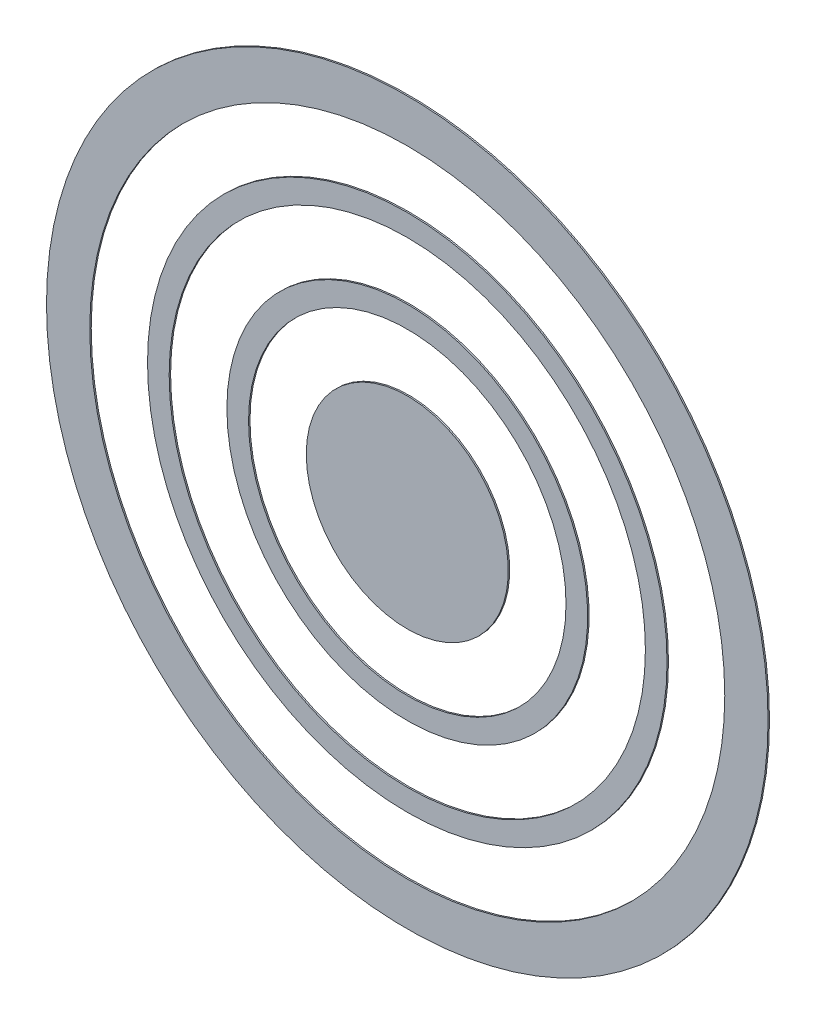
ISO-10303-21;
HEADER;
FILE_DESCRIPTION(('STEP AP214'),'2;1');
FILE_NAME('part.step','',(''),(''),'','','');
FILE_SCHEMA(('AUTOMOTIVE_DESIGN { 1 0 10303 214 1 1 1 1 }'));
ENDSEC;
DATA;
#1=APPLICATION_CONTEXT('core data for automotive mechanical design processes');
#2=APPLICATION_PROTOCOL_DEFINITION('international standard','automotive_design',2000,#1);
#3=PRODUCT_CONTEXT('',#1,'mechanical');
#4=PRODUCT('Part','Part','',(#3));
#5=PRODUCT_RELATED_PRODUCT_CATEGORY('part','',(#4));
#6=PRODUCT_DEFINITION_FORMATION('','',#4);
#7=PRODUCT_DEFINITION_CONTEXT('part definition',#1,'design');
#8=PRODUCT_DEFINITION('design','',#6,#7);
#9=PRODUCT_DEFINITION_SHAPE('','',#8);
#10=(LENGTH_UNIT() NAMED_UNIT(*) SI_UNIT(.MILLI.,.METRE.));
#11=(NAMED_UNIT(*) PLANE_ANGLE_UNIT() SI_UNIT($,.RADIAN.));
#12=(NAMED_UNIT(*) SI_UNIT($,.STERADIAN.) SOLID_ANGLE_UNIT());
#13=UNCERTAINTY_MEASURE_WITH_UNIT(LENGTH_MEASURE(1.E-05),#10,'distance_accuracy_value','');
#14=(GEOMETRIC_REPRESENTATION_CONTEXT(3) GLOBAL_UNCERTAINTY_ASSIGNED_CONTEXT((#13)) GLOBAL_UNIT_ASSIGNED_CONTEXT((#10,
#11,#12)) REPRESENTATION_CONTEXT('',''));
#15=CARTESIAN_POINT('',(0.,0.,0.));
#16=DIRECTION('',(0.,0.,1.));
#17=DIRECTION('',(1.,0.,0.));
#18=AXIS2_PLACEMENT_3D('',#15,#16,#17);
#19=CARTESIAN_POINT('',(0.,0.,0.01));
#20=DIRECTION('',(0.,0.,-1.));
#21=DIRECTION('',(-1.,0.,0.));
#22=AXIS2_PLACEMENT_3D('',#19,#20,#21);
#23=CYLINDRICAL_SURFACE('',#22,0.7);
#24=CARTESIAN_POINT('',(0.,0.,0.01));
#25=DIRECTION('',(0.,0.,1.));
#26=DIRECTION('',(1.,0.,0.));
#27=AXIS2_PLACEMENT_3D('',#24,#25,#26);
#28=CIRCLE('',#27,0.7);
#29=CARTESIAN_POINT('',(-0.7,0.,0.01));
#30=VERTEX_POINT('',#29);
#31=EDGE_CURVE('E12',#30,#30,#28,.T.);
#32=CARTESIAN_POINT('',(0.,0.,0.));
#33=DIRECTION('',(0.,0.,1.));
#34=DIRECTION('',(1.,0.,0.));
#35=AXIS2_PLACEMENT_3D('',#32,#33,#34);
#36=CIRCLE('',#35,0.7);
#37=CARTESIAN_POINT('',(-0.7,0.,0.));
#38=VERTEX_POINT('',#37);
#39=EDGE_CURVE('E83',#38,#38,#36,.T.);
#40=CARTESIAN_POINT('',(-0.7,0.,0.01));
#41=CARTESIAN_POINT('',(-0.7,0.,0.00989583333333333));
#42=CARTESIAN_POINT('',(-0.7,0.,0.00979166666666667));
#43=CARTESIAN_POINT('',(-0.7,0.,0.00958333333333333));
#44=CARTESIAN_POINT('',(-0.7,0.,0.00947916666666667));
#45=CARTESIAN_POINT('',(-0.7,0.,0.00927083333333333));
#46=CARTESIAN_POINT('',(-0.7,0.,0.00916666666666667));
#47=CARTESIAN_POINT('',(-0.7,0.,0.00895833333333333));
#48=CARTESIAN_POINT('',(-0.7,0.,0.00885416666666667));
#49=CARTESIAN_POINT('',(-0.7,0.,0.00864583333333333));
#50=CARTESIAN_POINT('',(-0.7,0.,0.00854166666666667));
#51=CARTESIAN_POINT('',(-0.7,0.,0.00833333333333333));
#52=CARTESIAN_POINT('',(-0.7,0.,0.00822916666666667));
#53=CARTESIAN_POINT('',(-0.7,0.,0.00802083333333333));
#54=CARTESIAN_POINT('',(-0.7,0.,0.00791666666666667));
#55=CARTESIAN_POINT('',(-0.7,0.,0.00770833333333333));
#56=CARTESIAN_POINT('',(-0.7,0.,0.00760416666666667));
#57=CARTESIAN_POINT('',(-0.7,0.,0.00739583333333333));
#58=CARTESIAN_POINT('',(-0.7,0.,0.00729166666666667));
#59=CARTESIAN_POINT('',(-0.7,0.,0.00708333333333333));
#60=CARTESIAN_POINT('',(-0.7,0.,0.00697916666666667));
#61=CARTESIAN_POINT('',(-0.7,0.,0.00677083333333333));
#62=CARTESIAN_POINT('',(-0.7,0.,0.00666666666666667));
#63=CARTESIAN_POINT('',(-0.7,0.,0.00645833333333333));
#64=CARTESIAN_POINT('',(-0.7,0.,0.00635416666666667));
#65=CARTESIAN_POINT('',(-0.7,0.,0.00614583333333333));
#66=CARTESIAN_POINT('',(-0.7,0.,0.00604166666666667));
#67=CARTESIAN_POINT('',(-0.7,0.,0.00583333333333333));
#68=CARTESIAN_POINT('',(-0.7,0.,0.00572916666666667));
#69=CARTESIAN_POINT('',(-0.7,0.,0.00552083333333333));
#70=CARTESIAN_POINT('',(-0.7,0.,0.00541666666666667));
#71=CARTESIAN_POINT('',(-0.7,0.,0.00520833333333333));
#72=CARTESIAN_POINT('',(-0.7,0.,0.00510416666666667));
#73=CARTESIAN_POINT('',(-0.7,0.,0.00489583333333333));
#74=CARTESIAN_POINT('',(-0.7,0.,0.00479166666666667));
#75=CARTESIAN_POINT('',(-0.7,0.,0.00458333333333333));
#76=CARTESIAN_POINT('',(-0.7,0.,0.00447916666666667));
#77=CARTESIAN_POINT('',(-0.7,0.,0.00427083333333333));
#78=CARTESIAN_POINT('',(-0.7,0.,0.00416666666666667));
#79=CARTESIAN_POINT('',(-0.7,0.,0.00395833333333333));
#80=CARTESIAN_POINT('',(-0.7,0.,0.00385416666666667));
#81=CARTESIAN_POINT('',(-0.7,0.,0.00364583333333333));
#82=CARTESIAN_POINT('',(-0.7,0.,0.00354166666666667));
#83=CARTESIAN_POINT('',(-0.7,0.,0.00333333333333333));
#84=CARTESIAN_POINT('',(-0.7,0.,0.00322916666666667));
#85=CARTESIAN_POINT('',(-0.7,0.,0.00302083333333333));
#86=CARTESIAN_POINT('',(-0.7,0.,0.00291666666666667));
#87=CARTESIAN_POINT('',(-0.7,0.,0.00270833333333333));
#88=CARTESIAN_POINT('',(-0.7,0.,0.00260416666666667));
#89=CARTESIAN_POINT('',(-0.7,0.,0.00239583333333333));
#90=CARTESIAN_POINT('',(-0.7,0.,0.00229166666666667));
#91=CARTESIAN_POINT('',(-0.7,0.,0.00208333333333333));
#92=CARTESIAN_POINT('',(-0.7,0.,0.00197916666666667));
#93=CARTESIAN_POINT('',(-0.7,0.,0.00177083333333333));
#94=CARTESIAN_POINT('',(-0.7,0.,0.00166666666666667));
#95=CARTESIAN_POINT('',(-0.7,0.,0.00145833333333333));
#96=CARTESIAN_POINT('',(-0.7,0.,0.00135416666666667));
#97=CARTESIAN_POINT('',(-0.7,0.,0.00114583333333333));
#98=CARTESIAN_POINT('',(-0.7,0.,0.00104166666666667));
#99=CARTESIAN_POINT('',(-0.7,0.,0.000833333333333334));
#100=CARTESIAN_POINT('',(-0.7,0.,0.000729166666666667));
#101=CARTESIAN_POINT('',(-0.7,0.,0.000520833333333334));
#102=CARTESIAN_POINT('',(-0.7,0.,0.000416666666666667));
#103=CARTESIAN_POINT('',(-0.7,0.,0.000208333333333334));
#104=CARTESIAN_POINT('',(-0.7,0.,0.000104166666666667));
#105=CARTESIAN_POINT('',(-0.7,0.,0.));
#106=B_SPLINE_CURVE_WITH_KNOTS('',3,(#40,#41,#42,#43,#44,#45,#46,#47,#48,#49,#50,#51,#52,#53,
#54,#55,#56,#57,#58,#59,#60,#61,#62,#63,#64,#65,#66,#67,#68,#69,#70,#71,#72,#73,#74,#75,#76,#77,
#78,#79,#80,#81,#82,#83,#84,#85,#86,#87,#88,#89,#90,#91,#92,#93,#94,#95,#96,#97,#98,#99,#100,
#101,#102,#103,#104,#105),.UNSPECIFIED.,.F.,.F.,(4,2,2,2,2,2,2,2,2,2,2,2,2,2,2,2,2,2,2,2,2,2,2,
2,2,2,2,2,2,2,2,2,4),(0.,0.000312500000000001,0.000625000000000002,0.000937500000000001,0.00125,
0.0015625,0.001875,0.0021875,0.0025,0.0028125,0.003125,0.0034375,0.00375,0.0040625,0.004375,
0.0046875,0.005,0.0053125,0.005625,0.0059375,0.00625,0.0065625,0.006875,0.0071875,0.0075,
0.0078125,0.008125,0.0084375,0.00875,0.0090625,0.009375,0.0096875,0.01),.UNSPECIFIED.);
#107=EDGE_CURVE('BSEAM80',#30,#38,#106,.T.);
#108=ORIENTED_EDGE('',*,*,#31,.F.);
#109=ORIENTED_EDGE('',*,*,#39,.T.);
#110=ORIENTED_EDGE('',*,*,#107,.T.);
#111=ORIENTED_EDGE('',*,*,#107,.F.);
#112=EDGE_LOOP('',(#108,#110,#109,#111));
#113=FACE_BOUND('',#112,.T.);
#114=ADVANCED_FACE('F80',(#113),#23,.T.);
#115=CARTESIAN_POINT('',(0.,0.,0.01));
#116=DIRECTION('',(0.,0.,1.));
#117=DIRECTION('',(1.,0.,0.));
#118=AXIS2_PLACEMENT_3D('',#115,#116,#117);
#119=PLANE('',#118);
#120=ORIENTED_EDGE('',*,*,#31,.T.);
#121=EDGE_LOOP('',(#120));
#122=FACE_BOUND('',#121,.T.);
#123=ADVANCED_FACE('F95',(#122),#119,.T.);
#124=CARTESIAN_POINT('',(0.,0.,0.));
#125=DIRECTION('',(0.,0.,1.));
#126=DIRECTION('',(1.,0.,0.));
#127=AXIS2_PLACEMENT_3D('',#124,#125,#126);
#128=PLANE('',#127);
#129=ORIENTED_EDGE('',*,*,#39,.F.);
#130=EDGE_LOOP('',(#129));
#131=FACE_BOUND('',#130,.T.);
#132=ADVANCED_FACE('F93',(#131),#128,.F.);
#133=CLOSED_SHELL('',(#114,#123,#132));
#134=MANIFOLD_SOLID_BREP('B2',#133);
#135=CARTESIAN_POINT('',(0.,0.,0.01));
#136=DIRECTION('',(0.,0.,-1.));
#137=DIRECTION('',(-1.,0.,0.));
#138=AXIS2_PLACEMENT_3D('',#135,#136,#137);
#139=CYLINDRICAL_SURFACE('',#138,1.1);
#140=CARTESIAN_POINT('',(0.,0.,0.01));
#141=DIRECTION('',(0.,0.,1.));
#142=DIRECTION('',(1.,0.,0.));
#143=AXIS2_PLACEMENT_3D('',#140,#141,#142);
#144=CIRCLE('',#143,1.1);
#145=CARTESIAN_POINT('',(-1.1,0.,0.01));
#146=VERTEX_POINT('',#145);
#147=EDGE_CURVE('E136',#146,#146,#144,.T.);
#148=CARTESIAN_POINT('',(0.,0.,0.));
#149=DIRECTION('',(0.,0.,1.));
#150=DIRECTION('',(1.,0.,0.));
#151=AXIS2_PLACEMENT_3D('',#148,#149,#150);
#152=CIRCLE('',#151,1.1);
#153=CARTESIAN_POINT('',(-1.1,0.,0.));
#154=VERTEX_POINT('',#153);
#155=EDGE_CURVE('E142',#154,#154,#152,.T.);
#156=CARTESIAN_POINT('',(-1.1,0.,0.01));
#157=CARTESIAN_POINT('',(-1.1,0.,0.00989583333333333));
#158=CARTESIAN_POINT('',(-1.1,0.,0.00979166666666667));
#159=CARTESIAN_POINT('',(-1.1,0.,0.00958333333333333));
#160=CARTESIAN_POINT('',(-1.1,0.,0.00947916666666667));
#161=CARTESIAN_POINT('',(-1.1,0.,0.00927083333333333));
#162=CARTESIAN_POINT('',(-1.1,0.,0.00916666666666667));
#163=CARTESIAN_POINT('',(-1.1,0.,0.00895833333333333));
#164=CARTESIAN_POINT('',(-1.1,0.,0.00885416666666667));
#165=CARTESIAN_POINT('',(-1.1,0.,0.00864583333333333));
#166=CARTESIAN_POINT('',(-1.1,0.,0.00854166666666667));
#167=CARTESIAN_POINT('',(-1.1,0.,0.00833333333333333));
#168=CARTESIAN_POINT('',(-1.1,0.,0.00822916666666667));
#169=CARTESIAN_POINT('',(-1.1,0.,0.00802083333333333));
#170=CARTESIAN_POINT('',(-1.1,0.,0.00791666666666667));
#171=CARTESIAN_POINT('',(-1.1,0.,0.00770833333333333));
#172=CARTESIAN_POINT('',(-1.1,0.,0.00760416666666667));
#173=CARTESIAN_POINT('',(-1.1,0.,0.00739583333333333));
#174=CARTESIAN_POINT('',(-1.1,0.,0.00729166666666667));
#175=CARTESIAN_POINT('',(-1.1,0.,0.00708333333333333));
#176=CARTESIAN_POINT('',(-1.1,0.,0.00697916666666667));
#177=CARTESIAN_POINT('',(-1.1,0.,0.00677083333333333));
#178=CARTESIAN_POINT('',(-1.1,0.,0.00666666666666667));
#179=CARTESIAN_POINT('',(-1.1,0.,0.00645833333333333));
#180=CARTESIAN_POINT('',(-1.1,0.,0.00635416666666667));
#181=CARTESIAN_POINT('',(-1.1,0.,0.00614583333333333));
#182=CARTESIAN_POINT('',(-1.1,0.,0.00604166666666667));
#183=CARTESIAN_POINT('',(-1.1,0.,0.00583333333333333));
#184=CARTESIAN_POINT('',(-1.1,0.,0.00572916666666667));
#185=CARTESIAN_POINT('',(-1.1,0.,0.00552083333333333));
#186=CARTESIAN_POINT('',(-1.1,0.,0.00541666666666667));
#187=CARTESIAN_POINT('',(-1.1,0.,0.00520833333333333));
#188=CARTESIAN_POINT('',(-1.1,0.,0.00510416666666667));
#189=CARTESIAN_POINT('',(-1.1,0.,0.00489583333333333));
#190=CARTESIAN_POINT('',(-1.1,0.,0.00479166666666667));
#191=CARTESIAN_POINT('',(-1.1,0.,0.00458333333333333));
#192=CARTESIAN_POINT('',(-1.1,0.,0.00447916666666667));
#193=CARTESIAN_POINT('',(-1.1,0.,0.00427083333333333));
#194=CARTESIAN_POINT('',(-1.1,0.,0.00416666666666667));
#195=CARTESIAN_POINT('',(-1.1,0.,0.00395833333333333));
#196=CARTESIAN_POINT('',(-1.1,0.,0.00385416666666667));
#197=CARTESIAN_POINT('',(-1.1,0.,0.00364583333333333));
#198=CARTESIAN_POINT('',(-1.1,0.,0.00354166666666667));
#199=CARTESIAN_POINT('',(-1.1,0.,0.00333333333333333));
#200=CARTESIAN_POINT('',(-1.1,0.,0.00322916666666667));
#201=CARTESIAN_POINT('',(-1.1,0.,0.00302083333333333));
#202=CARTESIAN_POINT('',(-1.1,0.,0.00291666666666667));
#203=CARTESIAN_POINT('',(-1.1,0.,0.00270833333333333));
#204=CARTESIAN_POINT('',(-1.1,0.,0.00260416666666667));
#205=CARTESIAN_POINT('',(-1.1,0.,0.00239583333333333));
#206=CARTESIAN_POINT('',(-1.1,0.,0.00229166666666667));
#207=CARTESIAN_POINT('',(-1.1,0.,0.00208333333333333));
#208=CARTESIAN_POINT('',(-1.1,0.,0.00197916666666667));
#209=CARTESIAN_POINT('',(-1.1,0.,0.00177083333333333));
#210=CARTESIAN_POINT('',(-1.1,0.,0.00166666666666667));
#211=CARTESIAN_POINT('',(-1.1,0.,0.00145833333333333));
#212=CARTESIAN_POINT('',(-1.1,0.,0.00135416666666667));
#213=CARTESIAN_POINT('',(-1.1,0.,0.00114583333333333));
#214=CARTESIAN_POINT('',(-1.1,0.,0.00104166666666667));
#215=CARTESIAN_POINT('',(-1.1,0.,0.000833333333333334));
#216=CARTESIAN_POINT('',(-1.1,0.,0.000729166666666667));
#217=CARTESIAN_POINT('',(-1.1,0.,0.000520833333333334));
#218=CARTESIAN_POINT('',(-1.1,0.,0.000416666666666667));
#219=CARTESIAN_POINT('',(-1.1,0.,0.000208333333333334));
#220=CARTESIAN_POINT('',(-1.1,0.,0.000104166666666667));
#221=CARTESIAN_POINT('',(-1.1,0.,0.));
#222=B_SPLINE_CURVE_WITH_KNOTS('',3,(#156,#157,#158,#159,#160,#161,#162,#163,#164,#165,#166,
#167,#168,#169,#170,#171,#172,#173,#174,#175,#176,#177,#178,#179,#180,#181,#182,#183,#184,#185,
#186,#187,#188,#189,#190,#191,#192,#193,#194,#195,#196,#197,#198,#199,#200,#201,#202,#203,#204,
#205,#206,#207,#208,#209,#210,#211,#212,#213,#214,#215,#216,#217,#218,#219,#220,#221),
.UNSPECIFIED.,.F.,.F.,(4,2,2,2,2,2,2,2,2,2,2,2,2,2,2,2,2,2,2,2,2,2,2,2,2,2,2,2,2,2,2,2,4),(0.,
0.000312499999999999,0.000624999999999998,0.000937499999999999,0.00125,0.0015625,0.001875,
0.0021875,0.0025,0.0028125,0.003125,0.0034375,0.00375,0.0040625,0.004375,0.0046875,0.005,
0.0053125,0.005625,0.0059375,0.00625,0.0065625,0.006875,0.0071875,0.0075,0.0078125,0.008125,
0.0084375,0.00875,0.0090625,0.009375,0.0096875,0.01),.UNSPECIFIED.);
#223=EDGE_CURVE('BSEAM129',#146,#154,#222,.T.);
#224=ORIENTED_EDGE('',*,*,#147,.T.);
#225=ORIENTED_EDGE('',*,*,#155,.F.);
#226=ORIENTED_EDGE('',*,*,#223,.T.);
#227=ORIENTED_EDGE('',*,*,#223,.F.);
#228=EDGE_LOOP('',(#224,#226,#225,#227));
#229=FACE_BOUND('',#228,.T.);
#230=ADVANCED_FACE('F129',(#229),#139,.F.);
#231=CARTESIAN_POINT('',(0.,0.,0.01));
#232=DIRECTION('',(0.,0.,-1.));
#233=DIRECTION('',(-1.,0.,0.));
#234=AXIS2_PLACEMENT_3D('',#231,#232,#233);
#235=CYLINDRICAL_SURFACE('',#234,1.25);
#236=CARTESIAN_POINT('',(0.,0.,0.01));
#237=DIRECTION('',(0.,0.,1.));
#238=DIRECTION('',(1.,0.,0.));
#239=AXIS2_PLACEMENT_3D('',#236,#237,#238);
#240=CIRCLE('',#239,1.25);
#241=CARTESIAN_POINT('',(-1.25,0.,0.01));
#242=VERTEX_POINT('',#241);
#243=EDGE_CURVE('E79',#242,#242,#240,.T.);
#244=CARTESIAN_POINT('',(0.,0.,0.));
#245=DIRECTION('',(0.,0.,1.));
#246=DIRECTION('',(1.,0.,0.));
#247=AXIS2_PLACEMENT_3D('',#244,#245,#246);
#248=CIRCLE('',#247,1.25);
#249=CARTESIAN_POINT('',(-1.25,0.,0.));
#250=VERTEX_POINT('',#249);
#251=EDGE_CURVE('E132',#250,#250,#248,.T.);
#252=CARTESIAN_POINT('',(-1.25,0.,0.01));
#253=CARTESIAN_POINT('',(-1.25,0.,0.00989583333333333));
#254=CARTESIAN_POINT('',(-1.25,0.,0.00979166666666667));
#255=CARTESIAN_POINT('',(-1.25,0.,0.00958333333333333));
#256=CARTESIAN_POINT('',(-1.25,0.,0.00947916666666667));
#257=CARTESIAN_POINT('',(-1.25,0.,0.00927083333333333));
#258=CARTESIAN_POINT('',(-1.25,0.,0.00916666666666667));
#259=CARTESIAN_POINT('',(-1.25,0.,0.00895833333333333));
#260=CARTESIAN_POINT('',(-1.25,0.,0.00885416666666667));
#261=CARTESIAN_POINT('',(-1.25,0.,0.00864583333333333));
#262=CARTESIAN_POINT('',(-1.25,0.,0.00854166666666667));
#263=CARTESIAN_POINT('',(-1.25,0.,0.00833333333333333));
#264=CARTESIAN_POINT('',(-1.25,0.,0.00822916666666667));
#265=CARTESIAN_POINT('',(-1.25,0.,0.00802083333333333));
#266=CARTESIAN_POINT('',(-1.25,0.,0.00791666666666667));
#267=CARTESIAN_POINT('',(-1.25,0.,0.00770833333333333));
#268=CARTESIAN_POINT('',(-1.25,0.,0.00760416666666667));
#269=CARTESIAN_POINT('',(-1.25,0.,0.00739583333333333));
#270=CARTESIAN_POINT('',(-1.25,0.,0.00729166666666667));
#271=CARTESIAN_POINT('',(-1.25,0.,0.00708333333333333));
#272=CARTESIAN_POINT('',(-1.25,0.,0.00697916666666667));
#273=CARTESIAN_POINT('',(-1.25,0.,0.00677083333333333));
#274=CARTESIAN_POINT('',(-1.25,0.,0.00666666666666667));
#275=CARTESIAN_POINT('',(-1.25,0.,0.00645833333333333));
#276=CARTESIAN_POINT('',(-1.25,0.,0.00635416666666667));
#277=CARTESIAN_POINT('',(-1.25,0.,0.00614583333333333));
#278=CARTESIAN_POINT('',(-1.25,0.,0.00604166666666667));
#279=CARTESIAN_POINT('',(-1.25,0.,0.00583333333333333));
#280=CARTESIAN_POINT('',(-1.25,0.,0.00572916666666667));
#281=CARTESIAN_POINT('',(-1.25,0.,0.00552083333333333));
#282=CARTESIAN_POINT('',(-1.25,0.,0.00541666666666667));
#283=CARTESIAN_POINT('',(-1.25,0.,0.00520833333333333));
#284=CARTESIAN_POINT('',(-1.25,0.,0.00510416666666667));
#285=CARTESIAN_POINT('',(-1.25,0.,0.00489583333333333));
#286=CARTESIAN_POINT('',(-1.25,0.,0.00479166666666667));
#287=CARTESIAN_POINT('',(-1.25,0.,0.00458333333333333));
#288=CARTESIAN_POINT('',(-1.25,0.,0.00447916666666667));
#289=CARTESIAN_POINT('',(-1.25,0.,0.00427083333333333));
#290=CARTESIAN_POINT('',(-1.25,0.,0.00416666666666667));
#291=CARTESIAN_POINT('',(-1.25,0.,0.00395833333333333));
#292=CARTESIAN_POINT('',(-1.25,0.,0.00385416666666667));
#293=CARTESIAN_POINT('',(-1.25,0.,0.00364583333333333));
#294=CARTESIAN_POINT('',(-1.25,0.,0.00354166666666667));
#295=CARTESIAN_POINT('',(-1.25,0.,0.00333333333333333));
#296=CARTESIAN_POINT('',(-1.25,0.,0.00322916666666667));
#297=CARTESIAN_POINT('',(-1.25,0.,0.00302083333333333));
#298=CARTESIAN_POINT('',(-1.25,0.,0.00291666666666667));
#299=CARTESIAN_POINT('',(-1.25,0.,0.00270833333333333));
#300=CARTESIAN_POINT('',(-1.25,0.,0.00260416666666667));
#301=CARTESIAN_POINT('',(-1.25,0.,0.00239583333333333));
#302=CARTESIAN_POINT('',(-1.25,0.,0.00229166666666667));
#303=CARTESIAN_POINT('',(-1.25,0.,0.00208333333333333));
#304=CARTESIAN_POINT('',(-1.25,0.,0.00197916666666667));
#305=CARTESIAN_POINT('',(-1.25,0.,0.00177083333333333));
#306=CARTESIAN_POINT('',(-1.25,0.,0.00166666666666667));
#307=CARTESIAN_POINT('',(-1.25,0.,0.00145833333333333));
#308=CARTESIAN_POINT('',(-1.25,0.,0.00135416666666667));
#309=CARTESIAN_POINT('',(-1.25,0.,0.00114583333333333));
#310=CARTESIAN_POINT('',(-1.25,0.,0.00104166666666667));
#311=CARTESIAN_POINT('',(-1.25,0.,0.000833333333333334));
#312=CARTESIAN_POINT('',(-1.25,0.,0.000729166666666667));
#313=CARTESIAN_POINT('',(-1.25,0.,0.000520833333333334));
#314=CARTESIAN_POINT('',(-1.25,0.,0.000416666666666667));
#315=CARTESIAN_POINT('',(-1.25,0.,0.000208333333333334));
#316=CARTESIAN_POINT('',(-1.25,0.,0.000104166666666667));
#317=CARTESIAN_POINT('',(-1.25,0.,0.));
#318=B_SPLINE_CURVE_WITH_KNOTS('',3,(#252,#253,#254,#255,#256,#257,#258,#259,#260,#261,#262,
#263,#264,#265,#266,#267,#268,#269,#270,#271,#272,#273,#274,#275,#276,#277,#278,#279,#280,#281,
#282,#283,#284,#285,#286,#287,#288,#289,#290,#291,#292,#293,#294,#295,#296,#297,#298,#299,#300,
#301,#302,#303,#304,#305,#306,#307,#308,#309,#310,#311,#312,#313,#314,#315,#316,#317),
.UNSPECIFIED.,.F.,.F.,(4,2,2,2,2,2,2,2,2,2,2,2,2,2,2,2,2,2,2,2,2,2,2,2,2,2,2,2,2,2,2,2,4),(0.,
0.000312500000000001,0.000625000000000002,0.000937500000000001,0.00125,0.0015625,0.001875,
0.0021875,0.0025,0.0028125,0.003125,0.0034375,0.00375,0.0040625,0.004375,0.0046875,0.005,
0.0053125,0.005625,0.0059375,0.00625,0.0065625,0.006875,0.0071875,0.0075,0.0078125,0.008125,
0.0084375,0.00875,0.0090625,0.009375,0.0096875,0.01),.UNSPECIFIED.);
#319=EDGE_CURVE('BSEAM149',#242,#250,#318,.T.);
#320=ORIENTED_EDGE('',*,*,#243,.F.);
#321=ORIENTED_EDGE('',*,*,#251,.T.);
#322=ORIENTED_EDGE('',*,*,#319,.T.);
#323=ORIENTED_EDGE('',*,*,#319,.F.);
#324=EDGE_LOOP('',(#320,#322,#321,#323));
#325=FACE_BOUND('',#324,.T.);
#326=ADVANCED_FACE('F149',(#325),#235,.T.);
#327=CARTESIAN_POINT('',(0.,0.,0.01));
#328=DIRECTION('',(0.,0.,1.));
#329=DIRECTION('',(1.,0.,0.));
#330=AXIS2_PLACEMENT_3D('',#327,#328,#329);
#331=PLANE('',#330);
#332=ORIENTED_EDGE('',*,*,#147,.F.);
#333=EDGE_LOOP('',(#332));
#334=FACE_BOUND('',#333,.T.);
#335=ORIENTED_EDGE('',*,*,#243,.T.);
#336=EDGE_LOOP('',(#335));
#337=FACE_BOUND('',#336,.T.);
#338=ADVANCED_FACE('F153',(#334,#337),#331,.T.);
#339=CARTESIAN_POINT('',(0.,0.,0.));
#340=DIRECTION('',(0.,0.,1.));
#341=DIRECTION('',(1.,0.,0.));
#342=AXIS2_PLACEMENT_3D('',#339,#340,#341);
#343=PLANE('',#342);
#344=ORIENTED_EDGE('',*,*,#155,.T.);
#345=EDGE_LOOP('',(#344));
#346=FACE_BOUND('',#345,.T.);
#347=ORIENTED_EDGE('',*,*,#251,.F.);
#348=EDGE_LOOP('',(#347));
#349=FACE_BOUND('',#348,.T.);
#350=ADVANCED_FACE('F151',(#346,#349),#343,.F.);
#351=CLOSED_SHELL('',(#230,#326,#338,#350));
#352=MANIFOLD_SOLID_BREP('B7',#351);
#353=CARTESIAN_POINT('',(0.,0.,0.01));
#354=DIRECTION('',(0.,0.,-1.));
#355=DIRECTION('',(-1.,0.,0.));
#356=AXIS2_PLACEMENT_3D('',#353,#354,#355);
#357=CYLINDRICAL_SURFACE('',#356,1.65);
#358=CARTESIAN_POINT('',(0.,0.,0.01));
#359=DIRECTION('',(0.,0.,1.));
#360=DIRECTION('',(1.,0.,0.));
#361=AXIS2_PLACEMENT_3D('',#358,#359,#360);
#362=CIRCLE('',#361,1.65);
#363=CARTESIAN_POINT('',(-1.65,0.,0.01));
#364=VERTEX_POINT('',#363);
#365=EDGE_CURVE('E205',#364,#364,#362,.T.);
#366=CARTESIAN_POINT('',(0.,0.,0.));
#367=DIRECTION('',(0.,0.,1.));
#368=DIRECTION('',(1.,0.,0.));
#369=AXIS2_PLACEMENT_3D('',#366,#367,#368);
#370=CIRCLE('',#369,1.65);
#371=CARTESIAN_POINT('',(-1.65,0.,0.));
#372=VERTEX_POINT('',#371);
#373=EDGE_CURVE('E211',#372,#372,#370,.T.);
#374=CARTESIAN_POINT('',(-1.65,0.,0.01));
#375=CARTESIAN_POINT('',(-1.65,0.,0.00989583333333333));
#376=CARTESIAN_POINT('',(-1.65,0.,0.00979166666666667));
#377=CARTESIAN_POINT('',(-1.65,0.,0.00958333333333333));
#378=CARTESIAN_POINT('',(-1.65,0.,0.00947916666666667));
#379=CARTESIAN_POINT('',(-1.65,0.,0.00927083333333333));
#380=CARTESIAN_POINT('',(-1.65,0.,0.00916666666666667));
#381=CARTESIAN_POINT('',(-1.65,0.,0.00895833333333333));
#382=CARTESIAN_POINT('',(-1.65,0.,0.00885416666666667));
#383=CARTESIAN_POINT('',(-1.65,0.,0.00864583333333333));
#384=CARTESIAN_POINT('',(-1.65,0.,0.00854166666666667));
#385=CARTESIAN_POINT('',(-1.65,0.,0.00833333333333333));
#386=CARTESIAN_POINT('',(-1.65,0.,0.00822916666666667));
#387=CARTESIAN_POINT('',(-1.65,0.,0.00802083333333333));
#388=CARTESIAN_POINT('',(-1.65,0.,0.00791666666666667));
#389=CARTESIAN_POINT('',(-1.65,0.,0.00770833333333333));
#390=CARTESIAN_POINT('',(-1.65,0.,0.00760416666666667));
#391=CARTESIAN_POINT('',(-1.65,0.,0.00739583333333333));
#392=CARTESIAN_POINT('',(-1.65,0.,0.00729166666666667));
#393=CARTESIAN_POINT('',(-1.65,0.,0.00708333333333333));
#394=CARTESIAN_POINT('',(-1.65,0.,0.00697916666666667));
#395=CARTESIAN_POINT('',(-1.65,0.,0.00677083333333333));
#396=CARTESIAN_POINT('',(-1.65,0.,0.00666666666666667));
#397=CARTESIAN_POINT('',(-1.65,0.,0.00645833333333333));
#398=CARTESIAN_POINT('',(-1.65,0.,0.00635416666666667));
#399=CARTESIAN_POINT('',(-1.65,0.,0.00614583333333333));
#400=CARTESIAN_POINT('',(-1.65,0.,0.00604166666666667));
#401=CARTESIAN_POINT('',(-1.65,0.,0.00583333333333333));
#402=CARTESIAN_POINT('',(-1.65,0.,0.00572916666666667));
#403=CARTESIAN_POINT('',(-1.65,0.,0.00552083333333333));
#404=CARTESIAN_POINT('',(-1.65,0.,0.00541666666666667));
#405=CARTESIAN_POINT('',(-1.65,0.,0.00520833333333333));
#406=CARTESIAN_POINT('',(-1.65,0.,0.00510416666666667));
#407=CARTESIAN_POINT('',(-1.65,0.,0.00489583333333333));
#408=CARTESIAN_POINT('',(-1.65,0.,0.00479166666666667));
#409=CARTESIAN_POINT('',(-1.65,0.,0.00458333333333333));
#410=CARTESIAN_POINT('',(-1.65,0.,0.00447916666666667));
#411=CARTESIAN_POINT('',(-1.65,0.,0.00427083333333333));
#412=CARTESIAN_POINT('',(-1.65,0.,0.00416666666666667));
#413=CARTESIAN_POINT('',(-1.65,0.,0.00395833333333333));
#414=CARTESIAN_POINT('',(-1.65,0.,0.00385416666666667));
#415=CARTESIAN_POINT('',(-1.65,0.,0.00364583333333333));
#416=CARTESIAN_POINT('',(-1.65,0.,0.00354166666666667));
#417=CARTESIAN_POINT('',(-1.65,0.,0.00333333333333333));
#418=CARTESIAN_POINT('',(-1.65,0.,0.00322916666666667));
#419=CARTESIAN_POINT('',(-1.65,0.,0.00302083333333333));
#420=CARTESIAN_POINT('',(-1.65,0.,0.00291666666666667));
#421=CARTESIAN_POINT('',(-1.65,0.,0.00270833333333333));
#422=CARTESIAN_POINT('',(-1.65,0.,0.00260416666666667));
#423=CARTESIAN_POINT('',(-1.65,0.,0.00239583333333333));
#424=CARTESIAN_POINT('',(-1.65,0.,0.00229166666666667));
#425=CARTESIAN_POINT('',(-1.65,0.,0.00208333333333333));
#426=CARTESIAN_POINT('',(-1.65,0.,0.00197916666666667));
#427=CARTESIAN_POINT('',(-1.65,0.,0.00177083333333333));
#428=CARTESIAN_POINT('',(-1.65,0.,0.00166666666666667));
#429=CARTESIAN_POINT('',(-1.65,0.,0.00145833333333333));
#430=CARTESIAN_POINT('',(-1.65,0.,0.00135416666666667));
#431=CARTESIAN_POINT('',(-1.65,0.,0.00114583333333333));
#432=CARTESIAN_POINT('',(-1.65,0.,0.00104166666666667));
#433=CARTESIAN_POINT('',(-1.65,0.,0.000833333333333334));
#434=CARTESIAN_POINT('',(-1.65,0.,0.000729166666666667));
#435=CARTESIAN_POINT('',(-1.65,0.,0.000520833333333334));
#436=CARTESIAN_POINT('',(-1.65,0.,0.000416666666666667));
#437=CARTESIAN_POINT('',(-1.65,0.,0.000208333333333334));
#438=CARTESIAN_POINT('',(-1.65,0.,0.000104166666666667));
#439=CARTESIAN_POINT('',(-1.65,0.,0.));
#440=B_SPLINE_CURVE_WITH_KNOTS('',3,(#374,#375,#376,#377,#378,#379,#380,#381,#382,#383,#384,
#385,#386,#387,#388,#389,#390,#391,#392,#393,#394,#395,#396,#397,#398,#399,#400,#401,#402,#403,
#404,#405,#406,#407,#408,#409,#410,#411,#412,#413,#414,#415,#416,#417,#418,#419,#420,#421,#422,
#423,#424,#425,#426,#427,#428,#429,#430,#431,#432,#433,#434,#435,#436,#437,#438,#439),
.UNSPECIFIED.,.F.,.F.,(4,2,2,2,2,2,2,2,2,2,2,2,2,2,2,2,2,2,2,2,2,2,2,2,2,2,2,2,2,2,2,2,4),(0.,
0.000312500000000001,0.000625000000000002,0.000937500000000001,0.00125,0.0015625,0.001875,
0.0021875,0.0025,0.0028125,0.003125,0.0034375,0.00375,0.0040625,0.004375,0.0046875,0.005,
0.0053125,0.005625,0.0059375,0.00625,0.0065625,0.006875,0.0071875,0.0075,0.0078125,0.008125,
0.0084375,0.00875,0.0090625,0.009375,0.0096875,0.01),.UNSPECIFIED.);
#441=EDGE_CURVE('BSEAM198',#364,#372,#440,.T.);
#442=ORIENTED_EDGE('',*,*,#365,.T.);
#443=ORIENTED_EDGE('',*,*,#373,.F.);
#444=ORIENTED_EDGE('',*,*,#441,.T.);
#445=ORIENTED_EDGE('',*,*,#441,.F.);
#446=EDGE_LOOP('',(#442,#444,#443,#445));
#447=FACE_BOUND('',#446,.T.);
#448=ADVANCED_FACE('F198',(#447),#357,.F.);
#449=CARTESIAN_POINT('',(0.,0.,0.01));
#450=DIRECTION('',(0.,0.,-1.));
#451=DIRECTION('',(-1.,0.,0.));
#452=AXIS2_PLACEMENT_3D('',#449,#450,#451);
#453=CYLINDRICAL_SURFACE('',#452,1.8);
#454=CARTESIAN_POINT('',(0.,0.,0.01));
#455=DIRECTION('',(0.,0.,1.));
#456=DIRECTION('',(1.,0.,0.));
#457=AXIS2_PLACEMENT_3D('',#454,#455,#456);
#458=CIRCLE('',#457,1.8);
#459=CARTESIAN_POINT('',(-1.8,0.,0.01));
#460=VERTEX_POINT('',#459);
#461=EDGE_CURVE('E128',#460,#460,#458,.T.);
#462=CARTESIAN_POINT('',(0.,0.,0.));
#463=DIRECTION('',(0.,0.,1.));
#464=DIRECTION('',(1.,0.,0.));
#465=AXIS2_PLACEMENT_3D('',#462,#463,#464);
#466=CIRCLE('',#465,1.8);
#467=CARTESIAN_POINT('',(-1.8,0.,0.));
#468=VERTEX_POINT('',#467);
#469=EDGE_CURVE('E201',#468,#468,#466,.T.);
#470=CARTESIAN_POINT('',(-1.8,0.,0.01));
#471=CARTESIAN_POINT('',(-1.8,0.,0.00989583333333333));
#472=CARTESIAN_POINT('',(-1.8,0.,0.00979166666666667));
#473=CARTESIAN_POINT('',(-1.8,0.,0.00958333333333333));
#474=CARTESIAN_POINT('',(-1.8,0.,0.00947916666666667));
#475=CARTESIAN_POINT('',(-1.8,0.,0.00927083333333333));
#476=CARTESIAN_POINT('',(-1.8,0.,0.00916666666666667));
#477=CARTESIAN_POINT('',(-1.8,0.,0.00895833333333333));
#478=CARTESIAN_POINT('',(-1.8,0.,0.00885416666666667));
#479=CARTESIAN_POINT('',(-1.8,0.,0.00864583333333333));
#480=CARTESIAN_POINT('',(-1.8,0.,0.00854166666666667));
#481=CARTESIAN_POINT('',(-1.8,0.,0.00833333333333333));
#482=CARTESIAN_POINT('',(-1.8,0.,0.00822916666666667));
#483=CARTESIAN_POINT('',(-1.8,0.,0.00802083333333333));
#484=CARTESIAN_POINT('',(-1.8,0.,0.00791666666666667));
#485=CARTESIAN_POINT('',(-1.8,0.,0.00770833333333333));
#486=CARTESIAN_POINT('',(-1.8,0.,0.00760416666666667));
#487=CARTESIAN_POINT('',(-1.8,0.,0.00739583333333333));
#488=CARTESIAN_POINT('',(-1.8,0.,0.00729166666666667));
#489=CARTESIAN_POINT('',(-1.8,0.,0.00708333333333333));
#490=CARTESIAN_POINT('',(-1.8,0.,0.00697916666666667));
#491=CARTESIAN_POINT('',(-1.8,0.,0.00677083333333333));
#492=CARTESIAN_POINT('',(-1.8,0.,0.00666666666666667));
#493=CARTESIAN_POINT('',(-1.8,0.,0.00645833333333333));
#494=CARTESIAN_POINT('',(-1.8,0.,0.00635416666666667));
#495=CARTESIAN_POINT('',(-1.8,0.,0.00614583333333333));
#496=CARTESIAN_POINT('',(-1.8,0.,0.00604166666666667));
#497=CARTESIAN_POINT('',(-1.8,0.,0.00583333333333333));
#498=CARTESIAN_POINT('',(-1.8,0.,0.00572916666666667));
#499=CARTESIAN_POINT('',(-1.8,0.,0.00552083333333333));
#500=CARTESIAN_POINT('',(-1.8,0.,0.00541666666666667));
#501=CARTESIAN_POINT('',(-1.8,0.,0.00520833333333333));
#502=CARTESIAN_POINT('',(-1.8,0.,0.00510416666666667));
#503=CARTESIAN_POINT('',(-1.8,0.,0.00489583333333333));
#504=CARTESIAN_POINT('',(-1.8,0.,0.00479166666666667));
#505=CARTESIAN_POINT('',(-1.8,0.,0.00458333333333333));
#506=CARTESIAN_POINT('',(-1.8,0.,0.00447916666666667));
#507=CARTESIAN_POINT('',(-1.8,0.,0.00427083333333333));
#508=CARTESIAN_POINT('',(-1.8,0.,0.00416666666666667));
#509=CARTESIAN_POINT('',(-1.8,0.,0.00395833333333333));
#510=CARTESIAN_POINT('',(-1.8,0.,0.00385416666666667));
#511=CARTESIAN_POINT('',(-1.8,0.,0.00364583333333333));
#512=CARTESIAN_POINT('',(-1.8,0.,0.00354166666666667));
#513=CARTESIAN_POINT('',(-1.8,0.,0.00333333333333333));
#514=CARTESIAN_POINT('',(-1.8,0.,0.00322916666666667));
#515=CARTESIAN_POINT('',(-1.8,0.,0.00302083333333333));
#516=CARTESIAN_POINT('',(-1.8,0.,0.00291666666666667));
#517=CARTESIAN_POINT('',(-1.8,0.,0.00270833333333333));
#518=CARTESIAN_POINT('',(-1.8,0.,0.00260416666666667));
#519=CARTESIAN_POINT('',(-1.8,0.,0.00239583333333333));
#520=CARTESIAN_POINT('',(-1.8,0.,0.00229166666666667));
#521=CARTESIAN_POINT('',(-1.8,0.,0.00208333333333333));
#522=CARTESIAN_POINT('',(-1.8,0.,0.00197916666666667));
#523=CARTESIAN_POINT('',(-1.8,0.,0.00177083333333333));
#524=CARTESIAN_POINT('',(-1.8,0.,0.00166666666666667));
#525=CARTESIAN_POINT('',(-1.8,0.,0.00145833333333333));
#526=CARTESIAN_POINT('',(-1.8,0.,0.00135416666666667));
#527=CARTESIAN_POINT('',(-1.8,0.,0.00114583333333333));
#528=CARTESIAN_POINT('',(-1.8,0.,0.00104166666666667));
#529=CARTESIAN_POINT('',(-1.8,0.,0.000833333333333334));
#530=CARTESIAN_POINT('',(-1.8,0.,0.000729166666666667));
#531=CARTESIAN_POINT('',(-1.8,0.,0.000520833333333334));
#532=CARTESIAN_POINT('',(-1.8,0.,0.000416666666666667));
#533=CARTESIAN_POINT('',(-1.8,0.,0.000208333333333334));
#534=CARTESIAN_POINT('',(-1.8,0.,0.000104166666666667));
#535=CARTESIAN_POINT('',(-1.8,0.,0.));
#536=B_SPLINE_CURVE_WITH_KNOTS('',3,(#470,#471,#472,#473,#474,#475,#476,#477,#478,#479,#480,
#481,#482,#483,#484,#485,#486,#487,#488,#489,#490,#491,#492,#493,#494,#495,#496,#497,#498,#499,
#500,#501,#502,#503,#504,#505,#506,#507,#508,#509,#510,#511,#512,#513,#514,#515,#516,#517,#518,
#519,#520,#521,#522,#523,#524,#525,#526,#527,#528,#529,#530,#531,#532,#533,#534,#535),
.UNSPECIFIED.,.F.,.F.,(4,2,2,2,2,2,2,2,2,2,2,2,2,2,2,2,2,2,2,2,2,2,2,2,2,2,2,2,2,2,2,2,4),(0.,
0.000312500000000001,0.000625000000000002,0.000937500000000001,0.00125,0.0015625,0.001875,
0.0021875,0.0025,0.0028125,0.003125,0.0034375,0.00375,0.0040625,0.004375,0.0046875,0.005,
0.0053125,0.005625,0.0059375,0.00625,0.0065625,0.006875,0.0071875,0.0075,0.0078125,0.008125,
0.0084375,0.00875,0.0090625,0.009375,0.0096875,0.01),.UNSPECIFIED.);
#537=EDGE_CURVE('BSEAM218',#460,#468,#536,.T.);
#538=ORIENTED_EDGE('',*,*,#461,.F.);
#539=ORIENTED_EDGE('',*,*,#469,.T.);
#540=ORIENTED_EDGE('',*,*,#537,.T.);
#541=ORIENTED_EDGE('',*,*,#537,.F.);
#542=EDGE_LOOP('',(#538,#540,#539,#541));
#543=FACE_BOUND('',#542,.T.);
#544=ADVANCED_FACE('F218',(#543),#453,.T.);
#545=CARTESIAN_POINT('',(0.,0.,0.01));
#546=DIRECTION('',(0.,0.,1.));
#547=DIRECTION('',(1.,0.,0.));
#548=AXIS2_PLACEMENT_3D('',#545,#546,#547);
#549=PLANE('',#548);
#550=ORIENTED_EDGE('',*,*,#365,.F.);
#551=EDGE_LOOP('',(#550));
#552=FACE_BOUND('',#551,.T.);
#553=ORIENTED_EDGE('',*,*,#461,.T.);
#554=EDGE_LOOP('',(#553));
#555=FACE_BOUND('',#554,.T.);
#556=ADVANCED_FACE('F222',(#552,#555),#549,.T.);
#557=CARTESIAN_POINT('',(0.,0.,0.));
#558=DIRECTION('',(0.,0.,1.));
#559=DIRECTION('',(1.,0.,0.));
#560=AXIS2_PLACEMENT_3D('',#557,#558,#559);
#561=PLANE('',#560);
#562=ORIENTED_EDGE('',*,*,#373,.T.);
#563=EDGE_LOOP('',(#562));
#564=FACE_BOUND('',#563,.T.);
#565=ORIENTED_EDGE('',*,*,#469,.F.);
#566=EDGE_LOOP('',(#565));
#567=FACE_BOUND('',#566,.T.);
#568=ADVANCED_FACE('F220',(#564,#567),#561,.F.);
#569=CLOSED_SHELL('',(#448,#544,#556,#568));
#570=MANIFOLD_SOLID_BREP('B74',#569);
#571=CARTESIAN_POINT('',(0.,0.,0.01));
#572=DIRECTION('',(0.,0.,-1.));
#573=DIRECTION('',(-1.,0.,0.));
#574=AXIS2_PLACEMENT_3D('',#571,#572,#573);
#575=CYLINDRICAL_SURFACE('',#574,2.2);
#576=CARTESIAN_POINT('',(0.,0.,0.01));
#577=DIRECTION('',(0.,0.,1.));
#578=DIRECTION('',(1.,0.,0.));
#579=AXIS2_PLACEMENT_3D('',#576,#577,#578);
#580=CIRCLE('',#579,2.2);
#581=CARTESIAN_POINT('',(-2.2,0.,0.01));
#582=VERTEX_POINT('',#581);
#583=EDGE_CURVE('E267',#582,#582,#580,.T.);
#584=CARTESIAN_POINT('',(0.,0.,0.));
#585=DIRECTION('',(0.,0.,1.));
#586=DIRECTION('',(1.,0.,0.));
#587=AXIS2_PLACEMENT_3D('',#584,#585,#586);
#588=CIRCLE('',#587,2.2);
#589=CARTESIAN_POINT('',(-2.2,0.,0.));
#590=VERTEX_POINT('',#589);
#591=EDGE_CURVE('E273',#590,#590,#588,.T.);
#592=CARTESIAN_POINT('',(-2.2,0.,0.01));
#593=CARTESIAN_POINT('',(-2.2,0.,0.00989583333333333));
#594=CARTESIAN_POINT('',(-2.2,0.,0.00979166666666667));
#595=CARTESIAN_POINT('',(-2.2,0.,0.00958333333333333));
#596=CARTESIAN_POINT('',(-2.2,0.,0.00947916666666667));
#597=CARTESIAN_POINT('',(-2.2,0.,0.00927083333333333));
#598=CARTESIAN_POINT('',(-2.2,0.,0.00916666666666667));
#599=CARTESIAN_POINT('',(-2.2,0.,0.00895833333333333));
#600=CARTESIAN_POINT('',(-2.2,0.,0.00885416666666667));
#601=CARTESIAN_POINT('',(-2.2,0.,0.00864583333333333));
#602=CARTESIAN_POINT('',(-2.2,0.,0.00854166666666667));
#603=CARTESIAN_POINT('',(-2.2,0.,0.00833333333333333));
#604=CARTESIAN_POINT('',(-2.2,0.,0.00822916666666667));
#605=CARTESIAN_POINT('',(-2.2,0.,0.00802083333333333));
#606=CARTESIAN_POINT('',(-2.2,0.,0.00791666666666667));
#607=CARTESIAN_POINT('',(-2.2,0.,0.00770833333333333));
#608=CARTESIAN_POINT('',(-2.2,0.,0.00760416666666667));
#609=CARTESIAN_POINT('',(-2.2,0.,0.00739583333333333));
#610=CARTESIAN_POINT('',(-2.2,0.,0.00729166666666667));
#611=CARTESIAN_POINT('',(-2.2,0.,0.00708333333333333));
#612=CARTESIAN_POINT('',(-2.2,0.,0.00697916666666667));
#613=CARTESIAN_POINT('',(-2.2,0.,0.00677083333333333));
#614=CARTESIAN_POINT('',(-2.2,0.,0.00666666666666667));
#615=CARTESIAN_POINT('',(-2.2,0.,0.00645833333333333));
#616=CARTESIAN_POINT('',(-2.2,0.,0.00635416666666667));
#617=CARTESIAN_POINT('',(-2.2,0.,0.00614583333333333));
#618=CARTESIAN_POINT('',(-2.2,0.,0.00604166666666667));
#619=CARTESIAN_POINT('',(-2.2,0.,0.00583333333333333));
#620=CARTESIAN_POINT('',(-2.2,0.,0.00572916666666667));
#621=CARTESIAN_POINT('',(-2.2,0.,0.00552083333333333));
#622=CARTESIAN_POINT('',(-2.2,0.,0.00541666666666667));
#623=CARTESIAN_POINT('',(-2.2,0.,0.00520833333333333));
#624=CARTESIAN_POINT('',(-2.2,0.,0.00510416666666667));
#625=CARTESIAN_POINT('',(-2.2,0.,0.00489583333333333));
#626=CARTESIAN_POINT('',(-2.2,0.,0.00479166666666667));
#627=CARTESIAN_POINT('',(-2.2,0.,0.00458333333333333));
#628=CARTESIAN_POINT('',(-2.2,0.,0.00447916666666667));
#629=CARTESIAN_POINT('',(-2.2,0.,0.00427083333333333));
#630=CARTESIAN_POINT('',(-2.2,0.,0.00416666666666667));
#631=CARTESIAN_POINT('',(-2.2,0.,0.00395833333333333));
#632=CARTESIAN_POINT('',(-2.2,0.,0.00385416666666667));
#633=CARTESIAN_POINT('',(-2.2,0.,0.00364583333333333));
#634=CARTESIAN_POINT('',(-2.2,0.,0.00354166666666667));
#635=CARTESIAN_POINT('',(-2.2,0.,0.00333333333333333));
#636=CARTESIAN_POINT('',(-2.2,0.,0.00322916666666667));
#637=CARTESIAN_POINT('',(-2.2,0.,0.00302083333333333));
#638=CARTESIAN_POINT('',(-2.2,0.,0.00291666666666667));
#639=CARTESIAN_POINT('',(-2.2,0.,0.00270833333333333));
#640=CARTESIAN_POINT('',(-2.2,0.,0.00260416666666667));
#641=CARTESIAN_POINT('',(-2.2,0.,0.00239583333333333));
#642=CARTESIAN_POINT('',(-2.2,0.,0.00229166666666667));
#643=CARTESIAN_POINT('',(-2.2,0.,0.00208333333333333));
#644=CARTESIAN_POINT('',(-2.2,0.,0.00197916666666667));
#645=CARTESIAN_POINT('',(-2.2,0.,0.00177083333333333));
#646=CARTESIAN_POINT('',(-2.2,0.,0.00166666666666667));
#647=CARTESIAN_POINT('',(-2.2,0.,0.00145833333333333));
#648=CARTESIAN_POINT('',(-2.2,0.,0.00135416666666667));
#649=CARTESIAN_POINT('',(-2.2,0.,0.00114583333333333));
#650=CARTESIAN_POINT('',(-2.2,0.,0.00104166666666667));
#651=CARTESIAN_POINT('',(-2.2,0.,0.000833333333333334));
#652=CARTESIAN_POINT('',(-2.2,0.,0.000729166666666667));
#653=CARTESIAN_POINT('',(-2.2,0.,0.000520833333333334));
#654=CARTESIAN_POINT('',(-2.2,0.,0.000416666666666667));
#655=CARTESIAN_POINT('',(-2.2,0.,0.000208333333333334));
#656=CARTESIAN_POINT('',(-2.2,0.,0.000104166666666667));
#657=CARTESIAN_POINT('',(-2.2,0.,0.));
#658=B_SPLINE_CURVE_WITH_KNOTS('',3,(#592,#593,#594,#595,#596,#597,#598,#599,#600,#601,#602,
#603,#604,#605,#606,#607,#608,#609,#610,#611,#612,#613,#614,#615,#616,#617,#618,#619,#620,#621,
#622,#623,#624,#625,#626,#627,#628,#629,#630,#631,#632,#633,#634,#635,#636,#637,#638,#639,#640,
#641,#642,#643,#644,#645,#646,#647,#648,#649,#650,#651,#652,#653,#654,#655,#656,#657),
.UNSPECIFIED.,.F.,.F.,(4,2,2,2,2,2,2,2,2,2,2,2,2,2,2,2,2,2,2,2,2,2,2,2,2,2,2,2,2,2,2,2,4),(0.,
0.000312500000000001,0.000625000000000002,0.000937500000000001,0.00125,0.0015625,0.001875,
0.0021875,0.0025,0.0028125,0.003125,0.0034375,0.00375,0.0040625,0.004375,0.0046875,0.005,
0.0053125,0.005625,0.0059375,0.00625,0.0065625,0.006875,0.0071875,0.0075,0.0078125,0.008125,
0.0084375,0.00875,0.0090625,0.009375,0.0096875,0.01),.UNSPECIFIED.);
#659=EDGE_CURVE('BSEAM260',#582,#590,#658,.T.);
#660=ORIENTED_EDGE('',*,*,#583,.T.);
#661=ORIENTED_EDGE('',*,*,#591,.F.);
#662=ORIENTED_EDGE('',*,*,#659,.T.);
#663=ORIENTED_EDGE('',*,*,#659,.F.);
#664=EDGE_LOOP('',(#660,#662,#661,#663));
#665=FACE_BOUND('',#664,.T.);
#666=ADVANCED_FACE('F260',(#665),#575,.F.);
#667=CARTESIAN_POINT('',(0.,0.,0.01));
#668=DIRECTION('',(0.,0.,-1.));
#669=DIRECTION('',(-1.,0.,0.));
#670=AXIS2_PLACEMENT_3D('',#667,#668,#669);
#671=CYLINDRICAL_SURFACE('',#670,2.5);
#672=CARTESIAN_POINT('',(0.,0.,0.01));
#673=DIRECTION('',(0.,0.,1.));
#674=DIRECTION('',(1.,0.,0.));
#675=AXIS2_PLACEMENT_3D('',#672,#673,#674);
#676=CIRCLE('',#675,2.5);
#677=CARTESIAN_POINT('',(-2.5,0.,0.01));
#678=VERTEX_POINT('',#677);
#679=EDGE_CURVE('E197',#678,#678,#676,.T.);
#680=CARTESIAN_POINT('',(0.,0.,0.));
#681=DIRECTION('',(0.,0.,1.));
#682=DIRECTION('',(1.,0.,0.));
#683=AXIS2_PLACEMENT_3D('',#680,#681,#682);
#684=CIRCLE('',#683,2.5);
#685=CARTESIAN_POINT('',(-2.5,0.,0.));
#686=VERTEX_POINT('',#685);
#687=EDGE_CURVE('E263',#686,#686,#684,.T.);
#688=CARTESIAN_POINT('',(-2.5,0.,0.01));
#689=CARTESIAN_POINT('',(-2.5,0.,0.00989583333333333));
#690=CARTESIAN_POINT('',(-2.5,0.,0.00979166666666667));
#691=CARTESIAN_POINT('',(-2.5,0.,0.00958333333333333));
#692=CARTESIAN_POINT('',(-2.5,0.,0.00947916666666667));
#693=CARTESIAN_POINT('',(-2.5,0.,0.00927083333333333));
#694=CARTESIAN_POINT('',(-2.5,0.,0.00916666666666667));
#695=CARTESIAN_POINT('',(-2.5,0.,0.00895833333333333));
#696=CARTESIAN_POINT('',(-2.5,0.,0.00885416666666667));
#697=CARTESIAN_POINT('',(-2.5,0.,0.00864583333333333));
#698=CARTESIAN_POINT('',(-2.5,0.,0.00854166666666667));
#699=CARTESIAN_POINT('',(-2.5,0.,0.00833333333333333));
#700=CARTESIAN_POINT('',(-2.5,0.,0.00822916666666667));
#701=CARTESIAN_POINT('',(-2.5,0.,0.00802083333333333));
#702=CARTESIAN_POINT('',(-2.5,0.,0.00791666666666667));
#703=CARTESIAN_POINT('',(-2.5,0.,0.00770833333333333));
#704=CARTESIAN_POINT('',(-2.5,0.,0.00760416666666667));
#705=CARTESIAN_POINT('',(-2.5,0.,0.00739583333333333));
#706=CARTESIAN_POINT('',(-2.5,0.,0.00729166666666667));
#707=CARTESIAN_POINT('',(-2.5,0.,0.00708333333333333));
#708=CARTESIAN_POINT('',(-2.5,0.,0.00697916666666667));
#709=CARTESIAN_POINT('',(-2.5,0.,0.00677083333333333));
#710=CARTESIAN_POINT('',(-2.5,0.,0.00666666666666667));
#711=CARTESIAN_POINT('',(-2.5,0.,0.00645833333333333));
#712=CARTESIAN_POINT('',(-2.5,0.,0.00635416666666667));
#713=CARTESIAN_POINT('',(-2.5,0.,0.00614583333333333));
#714=CARTESIAN_POINT('',(-2.5,0.,0.00604166666666667));
#715=CARTESIAN_POINT('',(-2.5,0.,0.00583333333333333));
#716=CARTESIAN_POINT('',(-2.5,0.,0.00572916666666667));
#717=CARTESIAN_POINT('',(-2.5,0.,0.00552083333333333));
#718=CARTESIAN_POINT('',(-2.5,0.,0.00541666666666667));
#719=CARTESIAN_POINT('',(-2.5,0.,0.00520833333333333));
#720=CARTESIAN_POINT('',(-2.5,0.,0.00510416666666667));
#721=CARTESIAN_POINT('',(-2.5,0.,0.00489583333333333));
#722=CARTESIAN_POINT('',(-2.5,0.,0.00479166666666667));
#723=CARTESIAN_POINT('',(-2.5,0.,0.00458333333333333));
#724=CARTESIAN_POINT('',(-2.5,0.,0.00447916666666667));
#725=CARTESIAN_POINT('',(-2.5,0.,0.00427083333333333));
#726=CARTESIAN_POINT('',(-2.5,0.,0.00416666666666667));
#727=CARTESIAN_POINT('',(-2.5,0.,0.00395833333333333));
#728=CARTESIAN_POINT('',(-2.5,0.,0.00385416666666667));
#729=CARTESIAN_POINT('',(-2.5,0.,0.00364583333333333));
#730=CARTESIAN_POINT('',(-2.5,0.,0.00354166666666667));
#731=CARTESIAN_POINT('',(-2.5,0.,0.00333333333333333));
#732=CARTESIAN_POINT('',(-2.5,0.,0.00322916666666667));
#733=CARTESIAN_POINT('',(-2.5,0.,0.00302083333333333));
#734=CARTESIAN_POINT('',(-2.5,0.,0.00291666666666667));
#735=CARTESIAN_POINT('',(-2.5,0.,0.00270833333333333));
#736=CARTESIAN_POINT('',(-2.5,0.,0.00260416666666667));
#737=CARTESIAN_POINT('',(-2.5,0.,0.00239583333333333));
#738=CARTESIAN_POINT('',(-2.5,0.,0.00229166666666667));
#739=CARTESIAN_POINT('',(-2.5,0.,0.00208333333333333));
#740=CARTESIAN_POINT('',(-2.5,0.,0.00197916666666667));
#741=CARTESIAN_POINT('',(-2.5,0.,0.00177083333333333));
#742=CARTESIAN_POINT('',(-2.5,0.,0.00166666666666667));
#743=CARTESIAN_POINT('',(-2.5,0.,0.00145833333333333));
#744=CARTESIAN_POINT('',(-2.5,0.,0.00135416666666667));
#745=CARTESIAN_POINT('',(-2.5,0.,0.00114583333333333));
#746=CARTESIAN_POINT('',(-2.5,0.,0.00104166666666667));
#747=CARTESIAN_POINT('',(-2.5,0.,0.000833333333333334));
#748=CARTESIAN_POINT('',(-2.5,0.,0.000729166666666667));
#749=CARTESIAN_POINT('',(-2.5,0.,0.000520833333333334));
#750=CARTESIAN_POINT('',(-2.5,0.,0.000416666666666667));
#751=CARTESIAN_POINT('',(-2.5,0.,0.000208333333333334));
#752=CARTESIAN_POINT('',(-2.5,0.,0.000104166666666667));
#753=CARTESIAN_POINT('',(-2.5,0.,0.));
#754=B_SPLINE_CURVE_WITH_KNOTS('',3,(#688,#689,#690,#691,#692,#693,#694,#695,#696,#697,#698,
#699,#700,#701,#702,#703,#704,#705,#706,#707,#708,#709,#710,#711,#712,#713,#714,#715,#716,#717,
#718,#719,#720,#721,#722,#723,#724,#725,#726,#727,#728,#729,#730,#731,#732,#733,#734,#735,#736,
#737,#738,#739,#740,#741,#742,#743,#744,#745,#746,#747,#748,#749,#750,#751,#752,#753),
.UNSPECIFIED.,.F.,.F.,(4,2,2,2,2,2,2,2,2,2,2,2,2,2,2,2,2,2,2,2,2,2,2,2,2,2,2,2,2,2,2,2,4),(0.,
0.000312499999999999,0.000624999999999998,0.000937499999999999,0.00125,0.0015625,0.001875,
0.0021875,0.0025,0.0028125,0.003125,0.0034375,0.00375,0.0040625,0.004375,0.0046875,0.005,
0.0053125,0.005625,0.0059375,0.00625,0.0065625,0.006875,0.0071875,0.0075,0.0078125,0.008125,
0.0084375,0.00875,0.0090625,0.009375,0.0096875,0.01),.UNSPECIFIED.);
#755=EDGE_CURVE('BSEAM280',#678,#686,#754,.T.);
#756=ORIENTED_EDGE('',*,*,#679,.F.);
#757=ORIENTED_EDGE('',*,*,#687,.T.);
#758=ORIENTED_EDGE('',*,*,#755,.T.);
#759=ORIENTED_EDGE('',*,*,#755,.F.);
#760=EDGE_LOOP('',(#756,#758,#757,#759));
#761=FACE_BOUND('',#760,.T.);
#762=ADVANCED_FACE('F280',(#761),#671,.T.);
#763=CARTESIAN_POINT('',(0.,0.,0.01));
#764=DIRECTION('',(0.,0.,1.));
#765=DIRECTION('',(1.,0.,0.));
#766=AXIS2_PLACEMENT_3D('',#763,#764,#765);
#767=PLANE('',#766);
#768=ORIENTED_EDGE('',*,*,#583,.F.);
#769=EDGE_LOOP('',(#768));
#770=FACE_BOUND('',#769,.T.);
#771=ORIENTED_EDGE('',*,*,#679,.T.);
#772=EDGE_LOOP('',(#771));
#773=FACE_BOUND('',#772,.T.);
#774=ADVANCED_FACE('F284',(#770,#773),#767,.T.);
#775=CARTESIAN_POINT('',(0.,0.,0.));
#776=DIRECTION('',(0.,0.,1.));
#777=DIRECTION('',(1.,0.,0.));
#778=AXIS2_PLACEMENT_3D('',#775,#776,#777);
#779=PLANE('',#778);
#780=ORIENTED_EDGE('',*,*,#591,.T.);
#781=EDGE_LOOP('',(#780));
#782=FACE_BOUND('',#781,.T.);
#783=ORIENTED_EDGE('',*,*,#687,.F.);
#784=EDGE_LOOP('',(#783));
#785=FACE_BOUND('',#784,.T.);
#786=ADVANCED_FACE('F282',(#782,#785),#779,.F.);
#787=CLOSED_SHELL('',(#666,#762,#774,#786));
#788=MANIFOLD_SOLID_BREP('B123',#787);
#789=ADVANCED_BREP_SHAPE_REPRESENTATION('',(#18,#134,#352,#570,#788),#14);
#790=SHAPE_DEFINITION_REPRESENTATION(#9,#789);
ENDSEC;
END-ISO-10303-21;
